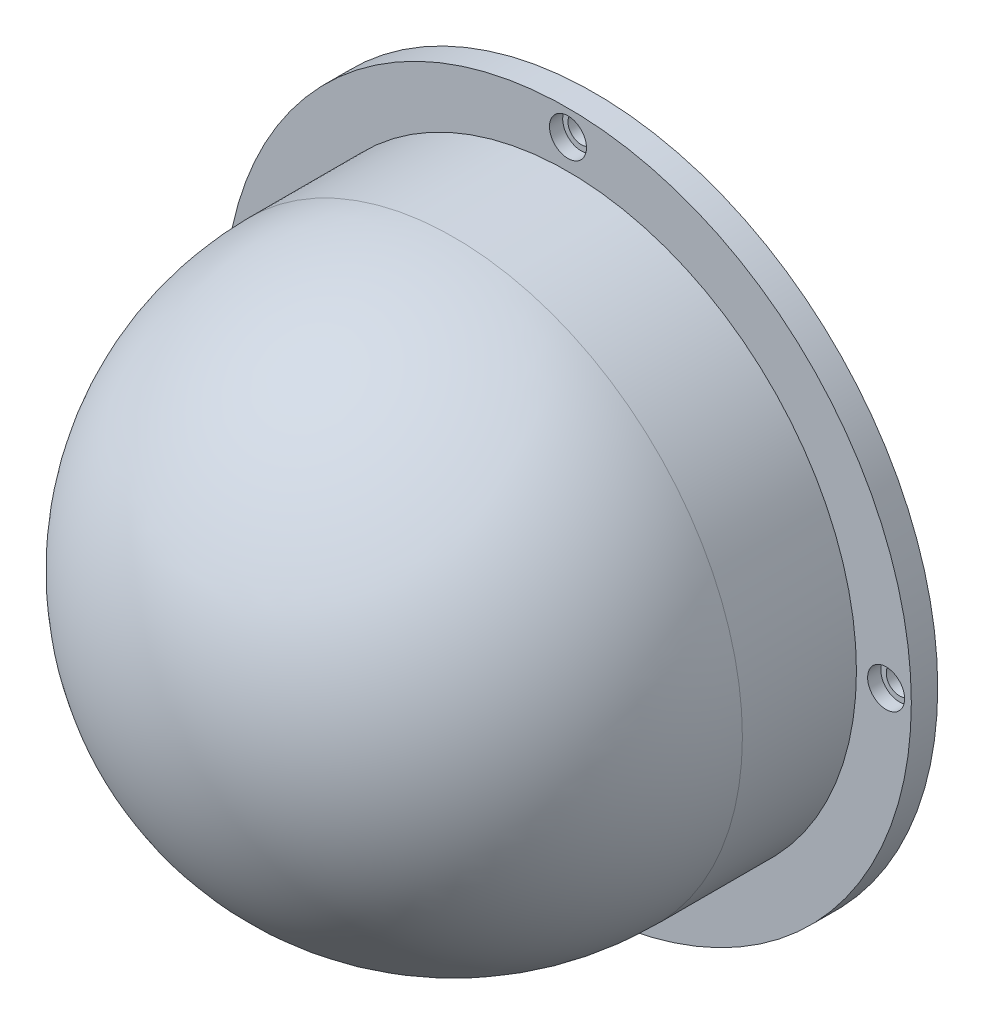
ISO-10303-21;
HEADER;
FILE_DESCRIPTION(('STEP AP214'),'2;1');
FILE_NAME('part.step','',(''),(''),'','','');
FILE_SCHEMA(('AUTOMOTIVE_DESIGN { 1 0 10303 214 1 1 1 1 }'));
ENDSEC;
DATA;
#1=APPLICATION_CONTEXT('core data for automotive mechanical design processes');
#2=APPLICATION_PROTOCOL_DEFINITION('international standard','automotive_design',2000,#1);
#3=PRODUCT_CONTEXT('',#1,'mechanical');
#4=PRODUCT('Part','Part','',(#3));
#5=PRODUCT_RELATED_PRODUCT_CATEGORY('part','',(#4));
#6=PRODUCT_DEFINITION_FORMATION('','',#4);
#7=PRODUCT_DEFINITION_CONTEXT('part definition',#1,'design');
#8=PRODUCT_DEFINITION('design','',#6,#7);
#9=PRODUCT_DEFINITION_SHAPE('','',#8);
#10=(LENGTH_UNIT() NAMED_UNIT(*) SI_UNIT(.MILLI.,.METRE.));
#11=(NAMED_UNIT(*) PLANE_ANGLE_UNIT() SI_UNIT($,.RADIAN.));
#12=(NAMED_UNIT(*) SI_UNIT($,.STERADIAN.) SOLID_ANGLE_UNIT());
#13=UNCERTAINTY_MEASURE_WITH_UNIT(LENGTH_MEASURE(1.E-05),#10,'distance_accuracy_value','');
#14=(GEOMETRIC_REPRESENTATION_CONTEXT(3) GLOBAL_UNCERTAINTY_ASSIGNED_CONTEXT((#13)) GLOBAL_UNIT_ASSIGNED_CONTEXT((#10,
#11,#12)) REPRESENTATION_CONTEXT('',''));
#15=CARTESIAN_POINT('',(0.,0.,0.));
#16=DIRECTION('',(0.,0.,1.));
#17=DIRECTION('',(1.,0.,0.));
#18=AXIS2_PLACEMENT_3D('',#15,#16,#17);
#19=CARTESIAN_POINT('',(60.2478467939616,6.31062698359791E-13,0.));
#20=DIRECTION('',(0.,0.,1.));
#21=DIRECTION('',(1.,0.,0.));
#22=AXIS2_PLACEMENT_3D('',#19,#20,#21);
#23=CYLINDRICAL_SURFACE('',#22,2.5);
#24=CARTESIAN_POINT('',(60.2478467939616,6.31062698359791E-13,0.));
#25=DIRECTION('',(0.,0.,1.));
#26=DIRECTION('',(0.,-1.,0.));
#27=AXIS2_PLACEMENT_3D('',#24,#25,#26);
#28=CIRCLE('',#27,2.5);
#29=CARTESIAN_POINT('',(60.2478467939616,-2.49999999999937,0.));
#30=VERTEX_POINT('',#29);
#31=EDGE_CURVE('E77',#30,#30,#28,.T.);
#32=ORIENTED_EDGE('',*,*,#31,.F.);
#33=EDGE_LOOP('',(#32));
#34=FACE_BOUND('',#33,.T.);
#35=CARTESIAN_POINT('',(60.2478467939616,6.31062698359791E-13,2.5));
#36=DIRECTION('',(0.,0.,1.));
#37=DIRECTION('',(1.,0.,0.));
#38=AXIS2_PLACEMENT_3D('',#35,#36,#37);
#39=CIRCLE('',#38,2.5);
#40=CARTESIAN_POINT('',(62.7478467939616,6.31062698359791E-13,2.5));
#41=VERTEX_POINT('',#40);
#42=EDGE_CURVE('E49',#41,#41,#39,.F.);
#43=ORIENTED_EDGE('',*,*,#42,.F.);
#44=EDGE_LOOP('',(#43));
#45=FACE_BOUND('',#44,.T.);
#46=ADVANCED_FACE('F45',(#34,#45),#23,.F.);
#47=CARTESIAN_POINT('',(0.,-60.2478467939616,0.));
#48=DIRECTION('',(0.,0.,1.));
#49=DIRECTION('',(1.,0.,0.));
#50=AXIS2_PLACEMENT_3D('',#47,#48,#49);
#51=CYLINDRICAL_SURFACE('',#50,2.5);
#52=CARTESIAN_POINT('',(0.,-60.2478467939616,0.));
#53=DIRECTION('',(0.,0.,1.));
#54=DIRECTION('',(-1.,0.,0.));
#55=AXIS2_PLACEMENT_3D('',#52,#53,#54);
#56=CIRCLE('',#55,2.5);
#57=CARTESIAN_POINT('',(-2.5,-60.2478467939616,0.));
#58=VERTEX_POINT('',#57);
#59=EDGE_CURVE('E81',#58,#58,#56,.T.);
#60=ORIENTED_EDGE('',*,*,#59,.F.);
#61=EDGE_LOOP('',(#60));
#62=FACE_BOUND('',#61,.T.);
#63=CARTESIAN_POINT('',(0.,-60.2478467939616,2.5));
#64=DIRECTION('',(0.,0.,1.));
#65=DIRECTION('',(1.,0.,0.));
#66=AXIS2_PLACEMENT_3D('',#63,#64,#65);
#67=CIRCLE('',#66,2.5);
#68=CARTESIAN_POINT('',(2.5,-60.2478467939616,2.5));
#69=VERTEX_POINT('',#68);
#70=EDGE_CURVE('E71',#69,#69,#67,.F.);
#71=ORIENTED_EDGE('',*,*,#70,.F.);
#72=EDGE_LOOP('',(#71));
#73=FACE_BOUND('',#72,.T.);
#74=ADVANCED_FACE('F126',(#62,#73),#51,.F.);
#75=CARTESIAN_POINT('',(-60.2478467939616,-2.10354232786597E-13,0.));
#76=DIRECTION('',(0.,0.,1.));
#77=DIRECTION('',(1.,0.,0.));
#78=AXIS2_PLACEMENT_3D('',#75,#76,#77);
#79=CYLINDRICAL_SURFACE('',#78,2.5);
#80=CARTESIAN_POINT('',(-60.2478467939616,-2.10354232786597E-13,0.));
#81=DIRECTION('',(0.,0.,1.));
#82=DIRECTION('',(0.,1.,0.));
#83=AXIS2_PLACEMENT_3D('',#80,#81,#82);
#84=CIRCLE('',#83,2.5);
#85=CARTESIAN_POINT('',(-60.2478467939616,2.49999999999979,0.));
#86=VERTEX_POINT('',#85);
#87=EDGE_CURVE('E86',#86,#86,#84,.T.);
#88=ORIENTED_EDGE('',*,*,#87,.F.);
#89=EDGE_LOOP('',(#88));
#90=FACE_BOUND('',#89,.T.);
#91=CARTESIAN_POINT('',(-60.2478467939616,-2.10354232786597E-13,2.5));
#92=DIRECTION('',(0.,0.,1.));
#93=DIRECTION('',(1.,0.,0.));
#94=AXIS2_PLACEMENT_3D('',#91,#92,#93);
#95=CIRCLE('',#94,2.5);
#96=CARTESIAN_POINT('',(-57.7478467939616,-2.10354232786597E-13,2.5));
#97=VERTEX_POINT('',#96);
#98=EDGE_CURVE('E69',#97,#97,#95,.F.);
#99=ORIENTED_EDGE('',*,*,#98,.F.);
#100=EDGE_LOOP('',(#99));
#101=FACE_BOUND('',#100,.T.);
#102=ADVANCED_FACE('F133',(#90,#101),#79,.F.);
#103=CARTESIAN_POINT('',(0.,60.2478467939616,0.));
#104=DIRECTION('',(0.,0.,1.));
#105=DIRECTION('',(1.,0.,0.));
#106=AXIS2_PLACEMENT_3D('',#103,#104,#105);
#107=CYLINDRICAL_SURFACE('',#106,2.5);
#108=CARTESIAN_POINT('',(0.,60.2478467939616,0.));
#109=DIRECTION('',(0.,0.,1.));
#110=DIRECTION('',(1.,0.,0.));
#111=AXIS2_PLACEMENT_3D('',#108,#109,#110);
#112=CIRCLE('',#111,2.5);
#113=CARTESIAN_POINT('',(2.5,60.2478467939616,0.));
#114=VERTEX_POINT('',#113);
#115=EDGE_CURVE('E67',#114,#114,#112,.T.);
#116=ORIENTED_EDGE('',*,*,#115,.F.);
#117=EDGE_LOOP('',(#116));
#118=FACE_BOUND('',#117,.T.);
#119=CARTESIAN_POINT('',(0.,60.2478467939616,2.5));
#120=DIRECTION('',(0.,0.,1.));
#121=DIRECTION('',(1.,0.,0.));
#122=AXIS2_PLACEMENT_3D('',#119,#120,#121);
#123=CIRCLE('',#122,2.5);
#124=CARTESIAN_POINT('',(2.5,60.2478467939616,2.5));
#125=VERTEX_POINT('',#124);
#126=EDGE_CURVE('E64',#125,#125,#123,.F.);
#127=ORIENTED_EDGE('',*,*,#126,.F.);
#128=EDGE_LOOP('',(#127));
#129=FACE_BOUND('',#128,.T.);
#130=ADVANCED_FACE('F148',(#118,#129),#107,.F.);
#131=CARTESIAN_POINT('',(0.,0.,5.));
#132=DIRECTION('',(0.,0.,-1.));
#133=DIRECTION('',(-1.,0.,0.));
#134=AXIS2_PLACEMENT_3D('',#131,#132,#133);
#135=CYLINDRICAL_SURFACE('',#134,65.);
#136=CARTESIAN_POINT('',(0.,0.,5.));
#137=DIRECTION('',(0.,0.,1.));
#138=DIRECTION('',(1.,0.,0.));
#139=AXIS2_PLACEMENT_3D('',#136,#137,#138);
#140=CIRCLE('',#139,65.);
#141=CARTESIAN_POINT('',(65.,0.,5.));
#142=VERTEX_POINT('',#141);
#143=EDGE_CURVE('E58',#142,#142,#140,.T.);
#144=ORIENTED_EDGE('',*,*,#143,.F.);
#145=EDGE_LOOP('',(#144));
#146=FACE_BOUND('',#145,.T.);
#147=CARTESIAN_POINT('',(0.,0.,0.));
#148=DIRECTION('',(0.,0.,1.));
#149=DIRECTION('',(1.,0.,0.));
#150=AXIS2_PLACEMENT_3D('',#147,#148,#149);
#151=CIRCLE('',#150,65.);
#152=CARTESIAN_POINT('',(65.,0.,0.));
#153=VERTEX_POINT('',#152);
#154=EDGE_CURVE('E62',#153,#153,#151,.T.);
#155=ORIENTED_EDGE('',*,*,#154,.T.);
#156=EDGE_LOOP('',(#155));
#157=FACE_BOUND('',#156,.T.);
#158=ADVANCED_FACE('F108',(#146,#157),#135,.T.);
#159=CARTESIAN_POINT('',(0.,0.,5.));
#160=DIRECTION('',(0.,0.,1.));
#161=DIRECTION('',(1.,0.,0.));
#162=AXIS2_PLACEMENT_3D('',#159,#160,#161);
#163=PLANE('',#162);
#164=CARTESIAN_POINT('',(-60.2236001036299,-2.10269575919775E-13,5.));
#165=DIRECTION('',(0.,0.,1.));
#166=DIRECTION('',(0.,1.,0.));
#167=AXIS2_PLACEMENT_3D('',#164,#165,#166);
#168=CIRCLE('',#167,3.5);
#169=CARTESIAN_POINT('',(-60.2236001036299,3.49999999999979,5.));
#170=VERTEX_POINT('',#169);
#171=EDGE_CURVE('E347',#170,#170,#168,.T.);
#172=ORIENTED_EDGE('',*,*,#171,.F.);
#173=EDGE_LOOP('',(#172));
#174=FACE_BOUND('',#173,.T.);
#175=CARTESIAN_POINT('',(0.,-60.2236001036299,5.));
#176=DIRECTION('',(0.,0.,1.));
#177=DIRECTION('',(-1.,0.,0.));
#178=AXIS2_PLACEMENT_3D('',#175,#176,#177);
#179=CIRCLE('',#178,3.5);
#180=CARTESIAN_POINT('',(-3.5,-60.2236001036299,5.));
#181=VERTEX_POINT('',#180);
#182=EDGE_CURVE('E335',#181,#181,#179,.T.);
#183=ORIENTED_EDGE('',*,*,#182,.F.);
#184=EDGE_LOOP('',(#183));
#185=FACE_BOUND('',#184,.T.);
#186=CARTESIAN_POINT('',(60.2236001036299,6.30808727759326E-13,5.));
#187=DIRECTION('',(0.,0.,1.));
#188=DIRECTION('',(0.,-1.,0.));
#189=AXIS2_PLACEMENT_3D('',#186,#187,#188);
#190=CIRCLE('',#189,3.5);
#191=CARTESIAN_POINT('',(60.22360010363,-3.49999999999937,5.));
#192=VERTEX_POINT('',#191);
#193=EDGE_CURVE('E332',#192,#192,#190,.T.);
#194=ORIENTED_EDGE('',*,*,#193,.F.);
#195=EDGE_LOOP('',(#194));
#196=FACE_BOUND('',#195,.T.);
#197=CARTESIAN_POINT('',(0.,60.2236001036299,5.));
#198=DIRECTION('',(0.,0.,1.));
#199=DIRECTION('',(1.,0.,0.));
#200=AXIS2_PLACEMENT_3D('',#197,#198,#199);
#201=CIRCLE('',#200,3.5);
#202=CARTESIAN_POINT('',(3.5,60.2236001036299,5.));
#203=VERTEX_POINT('',#202);
#204=EDGE_CURVE('E92',#203,#203,#201,.T.);
#205=ORIENTED_EDGE('',*,*,#204,.F.);
#206=EDGE_LOOP('',(#205));
#207=FACE_BOUND('',#206,.T.);
#208=CARTESIAN_POINT('',(0.,0.,5.));
#209=DIRECTION('',(0.,0.,1.));
#210=DIRECTION('',(1.,0.,0.));
#211=AXIS2_PLACEMENT_3D('',#208,#209,#210);
#212=CIRCLE('',#211,54.61);
#213=CARTESIAN_POINT('',(-54.61,0.,5.));
#214=VERTEX_POINT('',#213);
#215=EDGE_CURVE('E53',#214,#214,#212,.T.);
#216=ORIENTED_EDGE('',*,*,#215,.F.);
#217=EDGE_LOOP('',(#216));
#218=FACE_BOUND('',#217,.T.);
#219=ORIENTED_EDGE('',*,*,#143,.T.);
#220=EDGE_LOOP('',(#219));
#221=FACE_BOUND('',#220,.T.);
#222=ADVANCED_FACE('F113',(#174,#185,#196,#207,#218,#221),#163,.T.);
#223=CARTESIAN_POINT('',(0.,0.,0.));
#224=DIRECTION('',(0.,0.,1.));
#225=DIRECTION('',(1.,0.,0.));
#226=AXIS2_PLACEMENT_3D('',#223,#224,#225);
#227=PLANE('',#226);
#228=ORIENTED_EDGE('',*,*,#87,.T.);
#229=EDGE_LOOP('',(#228));
#230=FACE_BOUND('',#229,.T.);
#231=ORIENTED_EDGE('',*,*,#59,.T.);
#232=EDGE_LOOP('',(#231));
#233=FACE_BOUND('',#232,.T.);
#234=ORIENTED_EDGE('',*,*,#31,.T.);
#235=EDGE_LOOP('',(#234));
#236=FACE_BOUND('',#235,.T.);
#237=ORIENTED_EDGE('',*,*,#115,.T.);
#238=EDGE_LOOP('',(#237));
#239=FACE_BOUND('',#238,.T.);
#240=CARTESIAN_POINT('',(0.,0.,0.));
#241=DIRECTION('',(0.,0.,1.));
#242=DIRECTION('',(1.,0.,0.));
#243=AXIS2_PLACEMENT_3D('',#240,#241,#242);
#244=CIRCLE('',#243,49.61);
#245=CARTESIAN_POINT('',(-49.61,0.,0.));
#246=VERTEX_POINT('',#245);
#247=EDGE_CURVE('E97',#246,#246,#244,.T.);
#248=ORIENTED_EDGE('',*,*,#247,.T.);
#249=EDGE_LOOP('',(#248));
#250=FACE_BOUND('',#249,.T.);
#251=ORIENTED_EDGE('',*,*,#154,.F.);
#252=EDGE_LOOP('',(#251));
#253=FACE_BOUND('',#252,.T.);
#254=ADVANCED_FACE('F110',(#230,#233,#236,#239,#250,#253),#227,.F.);
#255=CARTESIAN_POINT('',(0.,0.,81.2));
#256=DIRECTION('',(0.,0.,-1.));
#257=DIRECTION('',(-1.,0.,0.));
#258=AXIS2_PLACEMENT_3D('',#255,#256,#257);
#259=CYLINDRICAL_SURFACE('',#258,54.61);
#260=CARTESIAN_POINT('',(0.,0.,26.59));
#261=DIRECTION('',(0.,0.,-1.));
#262=DIRECTION('',(-1.,0.,0.));
#263=AXIS2_PLACEMENT_3D('',#260,#261,#262);
#264=CIRCLE('',#263,54.61);
#265=CARTESIAN_POINT('',(-54.61,0.,26.59));
#266=VERTEX_POINT('',#265);
#267=EDGE_CURVE('E10',#266,#266,#264,.T.);
#268=CARTESIAN_POINT('',(-54.61,0.,26.59));
#269=CARTESIAN_POINT('',(-54.61,0.,26.3651041666667));
#270=CARTESIAN_POINT('',(-54.61,0.,26.1402083333333));
#271=CARTESIAN_POINT('',(-54.61,0.,25.6904166666667));
#272=CARTESIAN_POINT('',(-54.61,0.,25.4655208333333));
#273=CARTESIAN_POINT('',(-54.61,0.,25.0157291666667));
#274=CARTESIAN_POINT('',(-54.61,0.,24.7908333333333));
#275=CARTESIAN_POINT('',(-54.61,0.,24.3410416666667));
#276=CARTESIAN_POINT('',(-54.61,0.,24.1161458333333));
#277=CARTESIAN_POINT('',(-54.61,0.,23.6663541666667));
#278=CARTESIAN_POINT('',(-54.61,0.,23.4414583333333));
#279=CARTESIAN_POINT('',(-54.61,0.,22.9916666666667));
#280=CARTESIAN_POINT('',(-54.61,0.,22.7667708333333));
#281=CARTESIAN_POINT('',(-54.61,0.,22.3169791666667));
#282=CARTESIAN_POINT('',(-54.61,0.,22.0920833333333));
#283=CARTESIAN_POINT('',(-54.61,0.,21.6422916666667));
#284=CARTESIAN_POINT('',(-54.61,0.,21.4173958333333));
#285=CARTESIAN_POINT('',(-54.61,0.,20.9676041666667));
#286=CARTESIAN_POINT('',(-54.61,0.,20.7427083333333));
#287=CARTESIAN_POINT('',(-54.61,0.,20.2929166666667));
#288=CARTESIAN_POINT('',(-54.61,0.,20.0680208333333));
#289=CARTESIAN_POINT('',(-54.61,0.,19.6182291666667));
#290=CARTESIAN_POINT('',(-54.61,0.,19.3933333333333));
#291=CARTESIAN_POINT('',(-54.61,0.,18.9435416666667));
#292=CARTESIAN_POINT('',(-54.61,0.,18.7186458333333));
#293=CARTESIAN_POINT('',(-54.61,0.,18.2688541666667));
#294=CARTESIAN_POINT('',(-54.61,0.,18.0439583333333));
#295=CARTESIAN_POINT('',(-54.61,0.,17.5941666666667));
#296=CARTESIAN_POINT('',(-54.61,0.,17.3692708333333));
#297=CARTESIAN_POINT('',(-54.61,0.,16.9194791666667));
#298=CARTESIAN_POINT('',(-54.61,0.,16.6945833333333));
#299=CARTESIAN_POINT('',(-54.61,0.,16.2447916666667));
#300=CARTESIAN_POINT('',(-54.61,0.,16.0198958333333));
#301=CARTESIAN_POINT('',(-54.61,0.,15.5701041666667));
#302=CARTESIAN_POINT('',(-54.61,0.,15.3452083333333));
#303=CARTESIAN_POINT('',(-54.61,0.,14.8954166666667));
#304=CARTESIAN_POINT('',(-54.61,0.,14.6705208333333));
#305=CARTESIAN_POINT('',(-54.61,0.,14.2207291666667));
#306=CARTESIAN_POINT('',(-54.61,0.,13.9958333333333));
#307=CARTESIAN_POINT('',(-54.61,0.,13.5460416666667));
#308=CARTESIAN_POINT('',(-54.61,0.,13.3211458333333));
#309=CARTESIAN_POINT('',(-54.61,0.,12.8713541666667));
#310=CARTESIAN_POINT('',(-54.61,0.,12.6464583333333));
#311=CARTESIAN_POINT('',(-54.61,0.,12.1966666666667));
#312=CARTESIAN_POINT('',(-54.61,0.,11.9717708333333));
#313=CARTESIAN_POINT('',(-54.61,0.,11.5219791666667));
#314=CARTESIAN_POINT('',(-54.61,0.,11.2970833333333));
#315=CARTESIAN_POINT('',(-54.61,0.,10.8472916666667));
#316=CARTESIAN_POINT('',(-54.61,0.,10.6223958333333));
#317=CARTESIAN_POINT('',(-54.61,0.,10.1726041666667));
#318=CARTESIAN_POINT('',(-54.61,0.,9.94770833333334));
#319=CARTESIAN_POINT('',(-54.61,0.,9.49791666666668));
#320=CARTESIAN_POINT('',(-54.61,0.,9.27302083333334));
#321=CARTESIAN_POINT('',(-54.61,0.,8.82322916666667));
#322=CARTESIAN_POINT('',(-54.61,0.,8.59833333333334));
#323=CARTESIAN_POINT('',(-54.61,0.,8.14854166666668));
#324=CARTESIAN_POINT('',(-54.61,0.,7.92364583333334));
#325=CARTESIAN_POINT('',(-54.61,0.,7.47385416666667));
#326=CARTESIAN_POINT('',(-54.61,0.,7.24895833333334));
#327=CARTESIAN_POINT('',(-54.61,0.,6.79916666666668));
#328=CARTESIAN_POINT('',(-54.61,0.,6.57427083333334));
#329=CARTESIAN_POINT('',(-54.61,0.,6.12447916666667));
#330=CARTESIAN_POINT('',(-54.61,0.,5.89958333333333));
#331=CARTESIAN_POINT('',(-54.61,0.,5.44979166666667));
#332=CARTESIAN_POINT('',(-54.61,0.,5.22489583333334));
#333=CARTESIAN_POINT('',(-54.61,0.,5.));
#334=B_SPLINE_CURVE_WITH_KNOTS('',3,(#268,#269,#270,#271,#272,#273,#274,#275,#276,#277,#278,
#279,#280,#281,#282,#283,#284,#285,#286,#287,#288,#289,#290,#291,#292,#293,#294,#295,#296,#297,
#298,#299,#300,#301,#302,#303,#304,#305,#306,#307,#308,#309,#310,#311,#312,#313,#314,#315,#316,
#317,#318,#319,#320,#321,#322,#323,#324,#325,#326,#327,#328,#329,#330,#331,#332,#333),
.UNSPECIFIED.,.F.,.F.,(4,2,2,2,2,2,2,2,2,2,2,2,2,2,2,2,2,2,2,2,2,2,2,2,2,2,2,2,2,2,2,2,4),(0.,
0.6746875,1.349375,2.0240625,2.69875,3.3734375,4.048125,4.72281250000001,5.3975,
6.07218750000001,6.74687500000001,7.42156250000001,8.09624999999999,8.7709375,9.44562499999999,
10.1203125,10.795,11.4696875,12.144375,12.8190625,13.49375,14.1684375,14.843125,15.5178125,
16.1925,16.8671875,17.541875,18.2165625,18.89125,19.5659375,20.240625,20.9153125,21.59),.UNSPECIFIED.);
#335=EDGE_CURVE('BSEAM112',#266,#214,#334,.T.);
#336=ORIENTED_EDGE('',*,*,#267,.T.);
#337=ORIENTED_EDGE('',*,*,#215,.T.);
#338=ORIENTED_EDGE('',*,*,#335,.T.);
#339=ORIENTED_EDGE('',*,*,#335,.F.);
#340=EDGE_LOOP('',(#336,#338,#337,#339));
#341=FACE_BOUND('',#340,.T.);
#342=ADVANCED_FACE('F112',(#341),#259,.T.);
#343=CARTESIAN_POINT('',(0.,0.,26.59));
#344=DIRECTION('',(0.,0.,1.));
#345=DIRECTION('',(1.,0.,0.));
#346=AXIS2_PLACEMENT_3D('',#343,#344,#345);
#347=SPHERICAL_SURFACE('',#346,54.61);
#348=ORIENTED_EDGE('',*,*,#267,.F.);
#349=EDGE_LOOP('',(#348));
#350=FACE_BOUND('',#349,.T.);
#351=ADVANCED_FACE('F47',(#350),#347,.T.);
#352=CARTESIAN_POINT('',(0.,0.,81.2));
#353=DIRECTION('',(0.,0.,-1.));
#354=DIRECTION('',(-1.,0.,0.));
#355=AXIS2_PLACEMENT_3D('',#352,#353,#354);
#356=CYLINDRICAL_SURFACE('',#355,49.61);
#357=CARTESIAN_POINT('',(0.,0.,26.59));
#358=DIRECTION('',(0.,0.,-1.));
#359=DIRECTION('',(-1.,0.,0.));
#360=AXIS2_PLACEMENT_3D('',#357,#358,#359);
#361=CIRCLE('',#360,49.61);
#362=CARTESIAN_POINT('',(-49.61,0.,26.59));
#363=VERTEX_POINT('',#362);
#364=EDGE_CURVE('E100',#363,#363,#361,.T.);
#365=CARTESIAN_POINT('',(-49.61,0.,26.59));
#366=CARTESIAN_POINT('',(-49.61,0.,26.3130208333334));
#367=CARTESIAN_POINT('',(-49.61,0.,26.0360416666667));
#368=CARTESIAN_POINT('',(-49.61,0.,25.4820833333334));
#369=CARTESIAN_POINT('',(-49.61,0.,25.2051041666667));
#370=CARTESIAN_POINT('',(-49.61,0.,24.6511458333334));
#371=CARTESIAN_POINT('',(-49.61,0.,24.3741666666667));
#372=CARTESIAN_POINT('',(-49.61,0.,23.8202083333334));
#373=CARTESIAN_POINT('',(-49.61,0.,23.5432291666667));
#374=CARTESIAN_POINT('',(-49.61,0.,22.9892708333334));
#375=CARTESIAN_POINT('',(-49.61,0.,22.7122916666667));
#376=CARTESIAN_POINT('',(-49.61,0.,22.1583333333334));
#377=CARTESIAN_POINT('',(-49.61,0.,21.8813541666667));
#378=CARTESIAN_POINT('',(-49.61,0.,21.3273958333333));
#379=CARTESIAN_POINT('',(-49.61,0.,21.0504166666667));
#380=CARTESIAN_POINT('',(-49.61,0.,20.4964583333334));
#381=CARTESIAN_POINT('',(-49.61,0.,20.2194791666667));
#382=CARTESIAN_POINT('',(-49.61,0.,19.6655208333333));
#383=CARTESIAN_POINT('',(-49.61,0.,19.3885416666667));
#384=CARTESIAN_POINT('',(-49.61,0.,18.8345833333333));
#385=CARTESIAN_POINT('',(-49.61,0.,18.5576041666667));
#386=CARTESIAN_POINT('',(-49.61,0.,18.0036458333334));
#387=CARTESIAN_POINT('',(-49.61,0.,17.7266666666667));
#388=CARTESIAN_POINT('',(-49.61,0.,17.1727083333334));
#389=CARTESIAN_POINT('',(-49.61,0.,16.8957291666667));
#390=CARTESIAN_POINT('',(-49.61,0.,16.3417708333334));
#391=CARTESIAN_POINT('',(-49.61,0.,16.0647916666667));
#392=CARTESIAN_POINT('',(-49.61,0.,15.5108333333334));
#393=CARTESIAN_POINT('',(-49.61,0.,15.2338541666667));
#394=CARTESIAN_POINT('',(-49.61,0.,14.6798958333334));
#395=CARTESIAN_POINT('',(-49.61,0.,14.4029166666667));
#396=CARTESIAN_POINT('',(-49.61,0.,13.8489583333333));
#397=CARTESIAN_POINT('',(-49.61,0.,13.5719791666667));
#398=CARTESIAN_POINT('',(-49.61,0.,13.0180208333333));
#399=CARTESIAN_POINT('',(-49.61,0.,12.7410416666667));
#400=CARTESIAN_POINT('',(-49.61,0.,12.1870833333333));
#401=CARTESIAN_POINT('',(-49.61,0.,11.9101041666667));
#402=CARTESIAN_POINT('',(-49.61,0.,11.3561458333333));
#403=CARTESIAN_POINT('',(-49.61,0.,11.0791666666667));
#404=CARTESIAN_POINT('',(-49.61,0.,10.5252083333333));
#405=CARTESIAN_POINT('',(-49.61,0.,10.2482291666667));
#406=CARTESIAN_POINT('',(-49.61,0.,9.69427083333335));
#407=CARTESIAN_POINT('',(-49.61,0.,9.41729166666668));
#408=CARTESIAN_POINT('',(-49.61,0.,8.86333333333334));
#409=CARTESIAN_POINT('',(-49.61,0.,8.58635416666668));
#410=CARTESIAN_POINT('',(-49.61,0.,8.03239583333334));
#411=CARTESIAN_POINT('',(-49.61,0.,7.75541666666667));
#412=CARTESIAN_POINT('',(-49.61,0.,7.20145833333334));
#413=CARTESIAN_POINT('',(-49.61,0.,6.92447916666667));
#414=CARTESIAN_POINT('',(-49.61,0.,6.37052083333334));
#415=CARTESIAN_POINT('',(-49.61,0.,6.09354166666667));
#416=CARTESIAN_POINT('',(-49.61,0.,5.53958333333334));
#417=CARTESIAN_POINT('',(-49.61,0.,5.26260416666667));
#418=CARTESIAN_POINT('',(-49.61,0.,4.70864583333334));
#419=CARTESIAN_POINT('',(-49.61,0.,4.43166666666667));
#420=CARTESIAN_POINT('',(-49.61,0.,3.87770833333334));
#421=CARTESIAN_POINT('',(-49.61,0.,3.60072916666667));
#422=CARTESIAN_POINT('',(-49.61,0.,3.04677083333333));
#423=CARTESIAN_POINT('',(-49.61,0.,2.76979166666666));
#424=CARTESIAN_POINT('',(-49.61,0.,2.21583333333333));
#425=CARTESIAN_POINT('',(-49.61,0.,1.93885416666667));
#426=CARTESIAN_POINT('',(-49.61,0.,1.38489583333334));
#427=CARTESIAN_POINT('',(-49.61,0.,1.10791666666667));
#428=CARTESIAN_POINT('',(-49.61,0.,0.553958333333336));
#429=CARTESIAN_POINT('',(-49.61,0.,0.276979166666667));
#430=CARTESIAN_POINT('',(-49.61,0.,0.));
#431=B_SPLINE_CURVE_WITH_KNOTS('',3,(#365,#366,#367,#368,#369,#370,#371,#372,#373,#374,#375,
#376,#377,#378,#379,#380,#381,#382,#383,#384,#385,#386,#387,#388,#389,#390,#391,#392,#393,#394,
#395,#396,#397,#398,#399,#400,#401,#402,#403,#404,#405,#406,#407,#408,#409,#410,#411,#412,#413,
#414,#415,#416,#417,#418,#419,#420,#421,#422,#423,#424,#425,#426,#427,#428,#429,#430),
.UNSPECIFIED.,.F.,.F.,(4,2,2,2,2,2,2,2,2,2,2,2,2,2,2,2,2,2,2,2,2,2,2,2,2,2,2,2,2,2,2,2,4),(0.,
0.830937500000004,1.661875,2.4928125,3.32375,4.1546875,4.98562500000001,5.8165625,
6.64750000000001,7.47843750000001,8.309375,9.1403125,9.97125000000001,10.8021875,11.633125,
12.4640625,13.295,14.1259375,14.956875,15.7878125,16.61875,17.4496875,18.280625,19.1115625,
19.9425,20.7734375,21.604375,22.4353125,23.26625,24.0971875,24.928125,25.7590625,26.59),.UNSPECIFIED.);
#432=EDGE_CURVE('BSEAM152',#363,#246,#431,.T.);
#433=ORIENTED_EDGE('',*,*,#364,.F.);
#434=ORIENTED_EDGE('',*,*,#247,.F.);
#435=ORIENTED_EDGE('',*,*,#432,.T.);
#436=ORIENTED_EDGE('',*,*,#432,.F.);
#437=EDGE_LOOP('',(#433,#435,#434,#436));
#438=FACE_BOUND('',#437,.T.);
#439=ADVANCED_FACE('F152',(#438),#356,.F.);
#440=CARTESIAN_POINT('',(0.,0.,26.59));
#441=DIRECTION('',(0.,0.,1.));
#442=DIRECTION('',(1.,0.,0.));
#443=AXIS2_PLACEMENT_3D('',#440,#441,#442);
#444=SPHERICAL_SURFACE('',#443,49.61);
#445=ORIENTED_EDGE('',*,*,#364,.T.);
#446=EDGE_LOOP('',(#445));
#447=FACE_BOUND('',#446,.T.);
#448=ADVANCED_FACE('F143',(#447),#444,.F.);
#449=CARTESIAN_POINT('',(0.,60.2236001036299,2.5));
#450=DIRECTION('',(0.,0.,1.));
#451=DIRECTION('',(1.,0.,0.));
#452=AXIS2_PLACEMENT_3D('',#449,#450,#451);
#453=PLANE('',#452);
#454=CARTESIAN_POINT('',(0.,60.2236001036299,2.5));
#455=DIRECTION('',(0.,0.,1.));
#456=DIRECTION('',(1.,0.,0.));
#457=AXIS2_PLACEMENT_3D('',#454,#455,#456);
#458=CIRCLE('',#457,3.5);
#459=CARTESIAN_POINT('',(3.5,60.2236001036299,2.5));
#460=VERTEX_POINT('',#459);
#461=EDGE_CURVE('E68',#460,#460,#458,.T.);
#462=ORIENTED_EDGE('',*,*,#461,.T.);
#463=EDGE_LOOP('',(#462));
#464=FACE_BOUND('',#463,.T.);
#465=ORIENTED_EDGE('',*,*,#126,.T.);
#466=EDGE_LOOP('',(#465));
#467=FACE_BOUND('',#466,.T.);
#468=ADVANCED_FACE('F139',(#464,#467),#453,.T.);
#469=CARTESIAN_POINT('',(0.,60.2236001036299,2.5));
#470=DIRECTION('',(0.,0.,1.));
#471=DIRECTION('',(1.,0.,0.));
#472=AXIS2_PLACEMENT_3D('',#469,#470,#471);
#473=CYLINDRICAL_SURFACE('',#472,3.5);
#474=ORIENTED_EDGE('',*,*,#461,.F.);
#475=EDGE_LOOP('',(#474));
#476=FACE_BOUND('',#475,.T.);
#477=ORIENTED_EDGE('',*,*,#204,.T.);
#478=EDGE_LOOP('',(#477));
#479=FACE_BOUND('',#478,.T.);
#480=ADVANCED_FACE('F142',(#476,#479),#473,.F.);
#481=CARTESIAN_POINT('',(-60.2236001036299,-2.10269575919775E-13,2.5));
#482=DIRECTION('',(0.,0.,1.));
#483=DIRECTION('',(0.,1.,0.));
#484=AXIS2_PLACEMENT_3D('',#481,#482,#483);
#485=PLANE('',#484);
#486=CARTESIAN_POINT('',(-60.2236001036299,-2.10269575919775E-13,2.5));
#487=DIRECTION('',(0.,0.,1.));
#488=DIRECTION('',(0.,1.,0.));
#489=AXIS2_PLACEMENT_3D('',#486,#487,#488);
#490=CIRCLE('',#489,3.5);
#491=CARTESIAN_POINT('',(-60.2236001036299,3.49999999999979,2.5));
#492=VERTEX_POINT('',#491);
#493=EDGE_CURVE('E72',#492,#492,#490,.T.);
#494=ORIENTED_EDGE('',*,*,#493,.T.);
#495=EDGE_LOOP('',(#494));
#496=FACE_BOUND('',#495,.T.);
#497=ORIENTED_EDGE('',*,*,#98,.T.);
#498=EDGE_LOOP('',(#497));
#499=FACE_BOUND('',#498,.T.);
#500=ADVANCED_FACE('F146',(#496,#499),#485,.T.);
#501=CARTESIAN_POINT('',(-60.2236001036299,-2.10269575919775E-13,2.5));
#502=DIRECTION('',(0.,0.,1.));
#503=DIRECTION('',(1.,0.,0.));
#504=AXIS2_PLACEMENT_3D('',#501,#502,#503);
#505=CYLINDRICAL_SURFACE('',#504,3.5);
#506=ORIENTED_EDGE('',*,*,#493,.F.);
#507=EDGE_LOOP('',(#506));
#508=FACE_BOUND('',#507,.T.);
#509=ORIENTED_EDGE('',*,*,#171,.T.);
#510=EDGE_LOOP('',(#509));
#511=FACE_BOUND('',#510,.T.);
#512=ADVANCED_FACE('F273',(#508,#511),#505,.F.);
#513=CARTESIAN_POINT('',(0.,-60.2236001036299,2.5));
#514=DIRECTION('',(0.,0.,1.));
#515=DIRECTION('',(-1.,0.,0.));
#516=AXIS2_PLACEMENT_3D('',#513,#514,#515);
#517=PLANE('',#516);
#518=CARTESIAN_POINT('',(0.,-60.2236001036299,2.5));
#519=DIRECTION('',(0.,0.,1.));
#520=DIRECTION('',(-1.,0.,0.));
#521=AXIS2_PLACEMENT_3D('',#518,#519,#520);
#522=CIRCLE('',#521,3.5);
#523=CARTESIAN_POINT('',(-3.5,-60.2236001036299,2.5));
#524=VERTEX_POINT('',#523);
#525=EDGE_CURVE('E344',#524,#524,#522,.T.);
#526=ORIENTED_EDGE('',*,*,#525,.T.);
#527=EDGE_LOOP('',(#526));
#528=FACE_BOUND('',#527,.T.);
#529=ORIENTED_EDGE('',*,*,#70,.T.);
#530=EDGE_LOOP('',(#529));
#531=FACE_BOUND('',#530,.T.);
#532=ADVANCED_FACE('F283',(#528,#531),#517,.T.);
#533=CARTESIAN_POINT('',(0.,-60.2236001036299,2.5));
#534=DIRECTION('',(0.,0.,1.));
#535=DIRECTION('',(1.,0.,0.));
#536=AXIS2_PLACEMENT_3D('',#533,#534,#535);
#537=CYLINDRICAL_SURFACE('',#536,3.5);
#538=ORIENTED_EDGE('',*,*,#525,.F.);
#539=EDGE_LOOP('',(#538));
#540=FACE_BOUND('',#539,.T.);
#541=ORIENTED_EDGE('',*,*,#182,.T.);
#542=EDGE_LOOP('',(#541));
#543=FACE_BOUND('',#542,.T.);
#544=ADVANCED_FACE('F293',(#540,#543),#537,.F.);
#545=CARTESIAN_POINT('',(60.2236001036299,6.30808727759326E-13,2.5));
#546=DIRECTION('',(0.,0.,1.));
#547=DIRECTION('',(0.,-1.,0.));
#548=AXIS2_PLACEMENT_3D('',#545,#546,#547);
#549=PLANE('',#548);
#550=CARTESIAN_POINT('',(60.2236001036299,6.30808727759326E-13,2.5));
#551=DIRECTION('',(0.,0.,1.));
#552=DIRECTION('',(0.,-1.,0.));
#553=AXIS2_PLACEMENT_3D('',#550,#551,#552);
#554=CIRCLE('',#553,3.5);
#555=CARTESIAN_POINT('',(60.22360010363,-3.49999999999937,2.5));
#556=VERTEX_POINT('',#555);
#557=EDGE_CURVE('E329',#556,#556,#554,.T.);
#558=ORIENTED_EDGE('',*,*,#557,.T.);
#559=EDGE_LOOP('',(#558));
#560=FACE_BOUND('',#559,.T.);
#561=ORIENTED_EDGE('',*,*,#42,.T.);
#562=EDGE_LOOP('',(#561));
#563=FACE_BOUND('',#562,.T.);
#564=ADVANCED_FACE('F303',(#560,#563),#549,.T.);
#565=CARTESIAN_POINT('',(60.2236001036299,6.30808727759326E-13,2.5));
#566=DIRECTION('',(0.,0.,1.));
#567=DIRECTION('',(1.,0.,0.));
#568=AXIS2_PLACEMENT_3D('',#565,#566,#567);
#569=CYLINDRICAL_SURFACE('',#568,3.5);
#570=ORIENTED_EDGE('',*,*,#557,.F.);
#571=EDGE_LOOP('',(#570));
#572=FACE_BOUND('',#571,.T.);
#573=ORIENTED_EDGE('',*,*,#193,.T.);
#574=EDGE_LOOP('',(#573));
#575=FACE_BOUND('',#574,.T.);
#576=ADVANCED_FACE('F313',(#572,#575),#569,.F.);
#577=CLOSED_SHELL('',(#46,#74,#102,#130,#158,#222,#254,#342,#351,#439,#448,#468,#480,#500,#512,
#532,#544,#564,#576));
#578=MANIFOLD_SOLID_BREP('B2',#577);
#579=ADVANCED_BREP_SHAPE_REPRESENTATION('',(#18,#578),#14);
#580=SHAPE_DEFINITION_REPRESENTATION(#9,#579);
ENDSEC;
END-ISO-10303-21;
